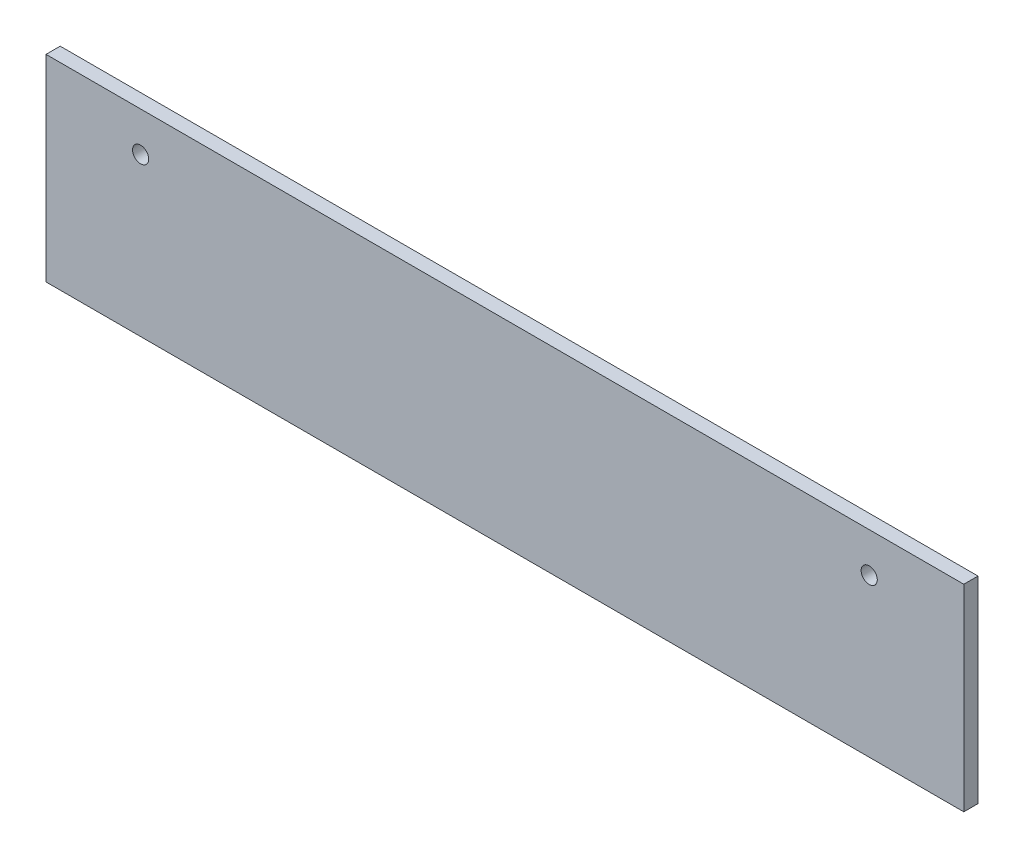
ISO-10303-21;
HEADER;
FILE_DESCRIPTION(('STEP AP214'),'2;1');
FILE_NAME('part.step','',(''),(''),'','','');
FILE_SCHEMA(('AUTOMOTIVE_DESIGN { 1 0 10303 214 1 1 1 1 }'));
ENDSEC;
DATA;
#1=APPLICATION_CONTEXT('core data for automotive mechanical design processes');
#2=APPLICATION_PROTOCOL_DEFINITION('international standard','automotive_design',2000,#1);
#3=PRODUCT_CONTEXT('',#1,'mechanical');
#4=PRODUCT('Part','Part','',(#3));
#5=PRODUCT_RELATED_PRODUCT_CATEGORY('part','',(#4));
#6=PRODUCT_DEFINITION_FORMATION('','',#4);
#7=PRODUCT_DEFINITION_CONTEXT('part definition',#1,'design');
#8=PRODUCT_DEFINITION('design','',#6,#7);
#9=PRODUCT_DEFINITION_SHAPE('','',#8);
#10=(LENGTH_UNIT() NAMED_UNIT(*) SI_UNIT(.MILLI.,.METRE.));
#11=(NAMED_UNIT(*) PLANE_ANGLE_UNIT() SI_UNIT($,.RADIAN.));
#12=(NAMED_UNIT(*) SI_UNIT($,.STERADIAN.) SOLID_ANGLE_UNIT());
#13=UNCERTAINTY_MEASURE_WITH_UNIT(LENGTH_MEASURE(1.E-05),#10,'distance_accuracy_value','');
#14=(GEOMETRIC_REPRESENTATION_CONTEXT(3) GLOBAL_UNCERTAINTY_ASSIGNED_CONTEXT((#13)) GLOBAL_UNIT_ASSIGNED_CONTEXT((#10,
#11,#12)) REPRESENTATION_CONTEXT('',''));
#15=CARTESIAN_POINT('',(0.,0.,0.));
#16=DIRECTION('',(0.,0.,1.));
#17=DIRECTION('',(1.,0.,0.));
#18=AXIS2_PLACEMENT_3D('',#15,#16,#17);
#19=CARTESIAN_POINT('',(0.,0.,3.6));
#20=DIRECTION('',(0.,0.,1.));
#21=DIRECTION('',(1.,0.,0.));
#22=AXIS2_PLACEMENT_3D('',#19,#20,#21);
#23=PLANE('',#22);
#24=CARTESIAN_POINT('',(-92.4,15.,3.6));
#25=DIRECTION('',(0.,0.,1.));
#26=DIRECTION('',(1.,0.,0.));
#27=AXIS2_PLACEMENT_3D('',#24,#25,#26);
#28=CIRCLE('',#27,2.04999999999999);
#29=CARTESIAN_POINT('',(-90.35,15.,3.6));
#30=VERTEX_POINT('',#29);
#31=EDGE_CURVE('E102',#30,#30,#28,.T.);
#32=ORIENTED_EDGE('',*,*,#31,.F.);
#33=EDGE_LOOP('',(#32));
#34=FACE_BOUND('',#33,.T.);
#35=DIRECTION('',(0.,-1.,0.));
#36=VECTOR('',#35,1.);
#37=CARTESIAN_POINT('',(-116.4,-25.,3.6));
#38=LINE('',#37,#36);
#39=CARTESIAN_POINT('',(-116.4,25.,3.6));
#40=VERTEX_POINT('',#39);
#41=CARTESIAN_POINT('',(-116.4,-25.,3.6));
#42=VERTEX_POINT('',#41);
#43=EDGE_CURVE('E87',#40,#42,#38,.T.);
#44=ORIENTED_EDGE('',*,*,#43,.T.);
#45=DIRECTION('',(1.,0.,0.));
#46=VECTOR('',#45,1.);
#47=CARTESIAN_POINT('',(116.4,-25.,3.6));
#48=LINE('',#47,#46);
#49=CARTESIAN_POINT('',(116.4,-25.,3.6));
#50=VERTEX_POINT('',#49);
#51=EDGE_CURVE('E82',#42,#50,#48,.T.);
#52=ORIENTED_EDGE('',*,*,#51,.T.);
#53=DIRECTION('',(0.,1.,0.));
#54=VECTOR('',#53,1.);
#55=CARTESIAN_POINT('',(116.4,-25.,3.6));
#56=LINE('',#55,#54);
#57=CARTESIAN_POINT('',(116.4,25.,3.6));
#58=VERTEX_POINT('',#57);
#59=EDGE_CURVE('E85',#50,#58,#56,.T.);
#60=ORIENTED_EDGE('',*,*,#59,.T.);
#61=DIRECTION('',(-1.,0.,0.));
#62=VECTOR('',#61,1.);
#63=CARTESIAN_POINT('',(116.4,25.,3.6));
#64=LINE('',#63,#62);
#65=EDGE_CURVE('E52',#58,#40,#64,.T.);
#66=ORIENTED_EDGE('',*,*,#65,.T.);
#67=EDGE_LOOP('',(#44,#52,#60,#66));
#68=FACE_BOUND('',#67,.T.);
#69=CARTESIAN_POINT('',(92.4,15.,3.6));
#70=DIRECTION('',(0.,0.,1.));
#71=DIRECTION('',(-1.,0.,0.));
#72=AXIS2_PLACEMENT_3D('',#69,#70,#71);
#73=CIRCLE('',#72,2.04999999999999);
#74=CARTESIAN_POINT('',(90.35,15.,3.6));
#75=VERTEX_POINT('',#74);
#76=EDGE_CURVE('E117',#75,#75,#73,.T.);
#77=ORIENTED_EDGE('',*,*,#76,.F.);
#78=EDGE_LOOP('',(#77));
#79=FACE_BOUND('',#78,.T.);
#80=ADVANCED_FACE('F35',(#34,#68,#79),#23,.T.);
#81=CARTESIAN_POINT('',(0.,0.,0.));
#82=DIRECTION('',(0.,0.,1.));
#83=DIRECTION('',(1.,0.,0.));
#84=AXIS2_PLACEMENT_3D('',#81,#82,#83);
#85=PLANE('',#84);
#86=DIRECTION('',(0.,-1.,0.));
#87=VECTOR('',#86,1.);
#88=CARTESIAN_POINT('',(-116.4,-25.,0.));
#89=LINE('',#88,#87);
#90=CARTESIAN_POINT('',(-116.4,25.,0.));
#91=VERTEX_POINT('',#90);
#92=CARTESIAN_POINT('',(-116.4,-25.,0.));
#93=VERTEX_POINT('',#92);
#94=EDGE_CURVE('E99',#91,#93,#89,.T.);
#95=ORIENTED_EDGE('',*,*,#94,.F.);
#96=DIRECTION('',(-1.,0.,0.));
#97=VECTOR('',#96,1.);
#98=CARTESIAN_POINT('',(116.4,25.,0.));
#99=LINE('',#98,#97);
#100=CARTESIAN_POINT('',(116.4,25.,0.));
#101=VERTEX_POINT('',#100);
#102=EDGE_CURVE('E75',#101,#91,#99,.T.);
#103=ORIENTED_EDGE('',*,*,#102,.F.);
#104=DIRECTION('',(0.,1.,0.));
#105=VECTOR('',#104,1.);
#106=CARTESIAN_POINT('',(116.4,-25.,0.));
#107=LINE('',#106,#105);
#108=CARTESIAN_POINT('',(116.4,-25.,0.));
#109=VERTEX_POINT('',#108);
#110=EDGE_CURVE('E69',#109,#101,#107,.T.);
#111=ORIENTED_EDGE('',*,*,#110,.F.);
#112=DIRECTION('',(1.,0.,0.));
#113=VECTOR('',#112,1.);
#114=CARTESIAN_POINT('',(116.4,-25.,0.));
#115=LINE('',#114,#113);
#116=EDGE_CURVE('E91',#93,#109,#115,.T.);
#117=ORIENTED_EDGE('',*,*,#116,.F.);
#118=EDGE_LOOP('',(#95,#103,#111,#117));
#119=FACE_BOUND('',#118,.T.);
#120=CARTESIAN_POINT('',(-92.4,15.,0.));
#121=DIRECTION('',(0.,0.,1.));
#122=DIRECTION('',(1.,0.,0.));
#123=AXIS2_PLACEMENT_3D('',#120,#121,#122);
#124=CIRCLE('',#123,2.04999999999999);
#125=CARTESIAN_POINT('',(-90.35,15.,0.));
#126=VERTEX_POINT('',#125);
#127=EDGE_CURVE('E114',#126,#126,#124,.T.);
#128=ORIENTED_EDGE('',*,*,#127,.T.);
#129=EDGE_LOOP('',(#128));
#130=FACE_BOUND('',#129,.T.);
#131=CARTESIAN_POINT('',(92.4,15.,0.));
#132=DIRECTION('',(0.,0.,1.));
#133=DIRECTION('',(-1.,0.,0.));
#134=AXIS2_PLACEMENT_3D('',#131,#132,#133);
#135=CIRCLE('',#134,2.04999999999999);
#136=CARTESIAN_POINT('',(90.35,15.,0.));
#137=VERTEX_POINT('',#136);
#138=EDGE_CURVE('E120',#137,#137,#135,.T.);
#139=ORIENTED_EDGE('',*,*,#138,.T.);
#140=EDGE_LOOP('',(#139));
#141=FACE_BOUND('',#140,.T.);
#142=ADVANCED_FACE('F110',(#119,#130,#141),#85,.F.);
#143=CARTESIAN_POINT('',(-116.4,-25.,3.6));
#144=DIRECTION('',(1.,0.,0.));
#145=DIRECTION('',(0.,0.,-1.));
#146=AXIS2_PLACEMENT_3D('',#143,#144,#145);
#147=PLANE('',#146);
#148=ORIENTED_EDGE('',*,*,#94,.T.);
#149=DIRECTION('',(0.,0.,-1.));
#150=VECTOR('',#149,1.);
#151=CARTESIAN_POINT('',(-116.4,-25.,3.6));
#152=LINE('',#151,#150);
#153=EDGE_CURVE('E11',#42,#93,#152,.T.);
#154=ORIENTED_EDGE('',*,*,#153,.F.);
#155=ORIENTED_EDGE('',*,*,#43,.F.);
#156=DIRECTION('',(0.,0.,-1.));
#157=VECTOR('',#156,1.);
#158=CARTESIAN_POINT('',(-116.4,25.,3.6));
#159=LINE('',#158,#157);
#160=EDGE_CURVE('E95',#40,#91,#159,.T.);
#161=ORIENTED_EDGE('',*,*,#160,.T.);
#162=EDGE_LOOP('',(#148,#154,#155,#161));
#163=FACE_BOUND('',#162,.T.);
#164=ADVANCED_FACE('F37',(#163),#147,.F.);
#165=CARTESIAN_POINT('',(116.4,-25.,3.6));
#166=DIRECTION('',(0.,1.,0.));
#167=DIRECTION('',(0.,0.,1.));
#168=AXIS2_PLACEMENT_3D('',#165,#166,#167);
#169=PLANE('',#168);
#170=ORIENTED_EDGE('',*,*,#116,.T.);
#171=DIRECTION('',(0.,0.,-1.));
#172=VECTOR('',#171,1.);
#173=CARTESIAN_POINT('',(116.4,-25.,3.6));
#174=LINE('',#173,#172);
#175=EDGE_CURVE('E44',#50,#109,#174,.T.);
#176=ORIENTED_EDGE('',*,*,#175,.F.);
#177=ORIENTED_EDGE('',*,*,#51,.F.);
#178=ORIENTED_EDGE('',*,*,#153,.T.);
#179=EDGE_LOOP('',(#170,#176,#177,#178));
#180=FACE_BOUND('',#179,.T.);
#181=ADVANCED_FACE('F90',(#180),#169,.F.);
#182=CARTESIAN_POINT('',(116.4,-25.,3.6));
#183=DIRECTION('',(-1.,0.,0.));
#184=DIRECTION('',(0.,0.,1.));
#185=AXIS2_PLACEMENT_3D('',#182,#183,#184);
#186=PLANE('',#185);
#187=ORIENTED_EDGE('',*,*,#110,.T.);
#188=DIRECTION('',(0.,0.,-1.));
#189=VECTOR('',#188,1.);
#190=CARTESIAN_POINT('',(116.4,25.,3.6));
#191=LINE('',#190,#189);
#192=EDGE_CURVE('E92',#58,#101,#191,.T.);
#193=ORIENTED_EDGE('',*,*,#192,.F.);
#194=ORIENTED_EDGE('',*,*,#59,.F.);
#195=ORIENTED_EDGE('',*,*,#175,.T.);
#196=EDGE_LOOP('',(#187,#193,#194,#195));
#197=FACE_BOUND('',#196,.T.);
#198=ADVANCED_FACE('F93',(#197),#186,.F.);
#199=CARTESIAN_POINT('',(116.4,25.,3.6));
#200=DIRECTION('',(0.,-1.,0.));
#201=DIRECTION('',(0.,0.,-1.));
#202=AXIS2_PLACEMENT_3D('',#199,#200,#201);
#203=PLANE('',#202);
#204=ORIENTED_EDGE('',*,*,#102,.T.);
#205=ORIENTED_EDGE('',*,*,#160,.F.);
#206=ORIENTED_EDGE('',*,*,#65,.F.);
#207=ORIENTED_EDGE('',*,*,#192,.T.);
#208=EDGE_LOOP('',(#204,#205,#206,#207));
#209=FACE_BOUND('',#208,.T.);
#210=ADVANCED_FACE('F107',(#209),#203,.F.);
#211=CARTESIAN_POINT('',(-92.4,15.,3.6));
#212=DIRECTION('',(0.,0.,-1.));
#213=DIRECTION('',(-1.,0.,0.));
#214=AXIS2_PLACEMENT_3D('',#211,#212,#213);
#215=CYLINDRICAL_SURFACE('',#214,2.04999999999999);
#216=ORIENTED_EDGE('',*,*,#31,.T.);
#217=EDGE_LOOP('',(#216));
#218=FACE_BOUND('',#217,.T.);
#219=ORIENTED_EDGE('',*,*,#127,.F.);
#220=EDGE_LOOP('',(#219));
#221=FACE_BOUND('',#220,.T.);
#222=ADVANCED_FACE('F137',(#218,#221),#215,.F.);
#223=CARTESIAN_POINT('',(92.4,15.,3.6));
#224=DIRECTION('',(0.,0.,-1.));
#225=DIRECTION('',(-1.,0.,0.));
#226=AXIS2_PLACEMENT_3D('',#223,#224,#225);
#227=CYLINDRICAL_SURFACE('',#226,2.04999999999999);
#228=ORIENTED_EDGE('',*,*,#76,.T.);
#229=EDGE_LOOP('',(#228));
#230=FACE_BOUND('',#229,.T.);
#231=ORIENTED_EDGE('',*,*,#138,.F.);
#232=EDGE_LOOP('',(#231));
#233=FACE_BOUND('',#232,.T.);
#234=ADVANCED_FACE('F126',(#230,#233),#227,.F.);
#235=CLOSED_SHELL('',(#80,#142,#164,#181,#198,#210,#222,#234));
#236=MANIFOLD_SOLID_BREP('B2',#235);
#237=ADVANCED_BREP_SHAPE_REPRESENTATION('',(#18,#236),#14);
#238=SHAPE_DEFINITION_REPRESENTATION(#9,#237);
ENDSEC;
END-ISO-10303-21;
